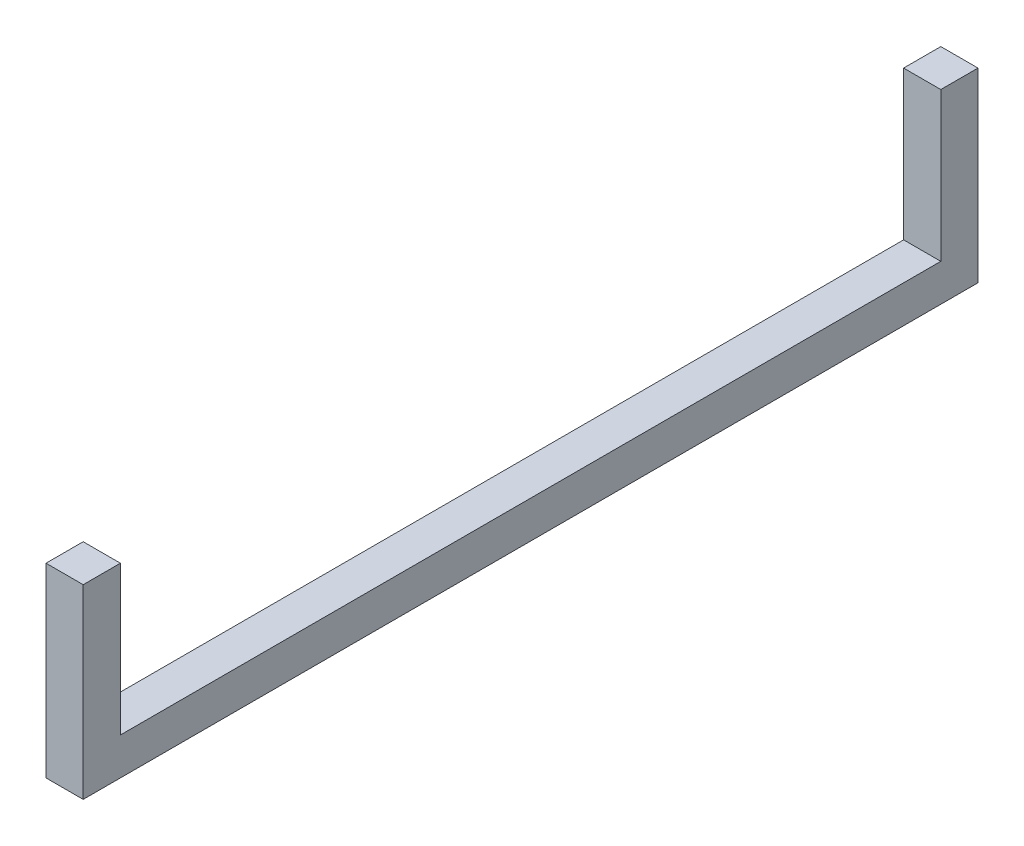
ISO-10303-21;
HEADER;
FILE_DESCRIPTION(('STEP AP214'),'2;1');
FILE_NAME('part.step','',(''),(''),'','','');
FILE_SCHEMA(('AUTOMOTIVE_DESIGN { 1 0 10303 214 1 1 1 1 }'));
ENDSEC;
DATA;
#1=APPLICATION_CONTEXT('core data for automotive mechanical design processes');
#2=APPLICATION_PROTOCOL_DEFINITION('international standard','automotive_design',2000,#1);
#3=PRODUCT_CONTEXT('',#1,'mechanical');
#4=PRODUCT('Part','Part','',(#3));
#5=PRODUCT_RELATED_PRODUCT_CATEGORY('part','',(#4));
#6=PRODUCT_DEFINITION_FORMATION('','',#4);
#7=PRODUCT_DEFINITION_CONTEXT('part definition',#1,'design');
#8=PRODUCT_DEFINITION('design','',#6,#7);
#9=PRODUCT_DEFINITION_SHAPE('','',#8);
#10=(LENGTH_UNIT() NAMED_UNIT(*) SI_UNIT(.MILLI.,.METRE.));
#11=(NAMED_UNIT(*) PLANE_ANGLE_UNIT() SI_UNIT($,.RADIAN.));
#12=(NAMED_UNIT(*) SI_UNIT($,.STERADIAN.) SOLID_ANGLE_UNIT());
#13=UNCERTAINTY_MEASURE_WITH_UNIT(LENGTH_MEASURE(1.E-05),#10,'distance_accuracy_value','');
#14=(GEOMETRIC_REPRESENTATION_CONTEXT(3) GLOBAL_UNCERTAINTY_ASSIGNED_CONTEXT((#13)) GLOBAL_UNIT_ASSIGNED_CONTEXT((#10,
#11,#12)) REPRESENTATION_CONTEXT('',''));
#15=CARTESIAN_POINT('',(0.,0.,0.));
#16=DIRECTION('',(0.,0.,1.));
#17=DIRECTION('',(1.,0.,0.));
#18=AXIS2_PLACEMENT_3D('',#15,#16,#17);
#19=CARTESIAN_POINT('',(-2.5,2.5,120.28));
#20=DIRECTION('',(0.,-1.,0.));
#21=DIRECTION('',(1.,0.,0.));
#22=AXIS2_PLACEMENT_3D('',#19,#20,#21);
#23=PLANE('',#22);
#24=DIRECTION('',(-1.,0.,0.));
#25=VECTOR('',#24,1.);
#26=CARTESIAN_POINT('',(-2.5,2.5,115.28));
#27=LINE('',#26,#25);
#28=CARTESIAN_POINT('',(2.5,2.5,115.28));
#29=VERTEX_POINT('',#28);
#30=CARTESIAN_POINT('',(-2.5,2.5,115.28));
#31=VERTEX_POINT('',#30);
#32=EDGE_CURVE('E143',#29,#31,#27,.T.);
#33=ORIENTED_EDGE('',*,*,#32,.F.);
#34=DIRECTION('',(0.,0.,-1.));
#35=VECTOR('',#34,1.);
#36=CARTESIAN_POINT('',(2.5,2.5,120.28));
#37=LINE('',#36,#35);
#38=CARTESIAN_POINT('',(2.5,2.5,5.));
#39=VERTEX_POINT('',#38);
#40=EDGE_CURVE('E90',#29,#39,#37,.T.);
#41=ORIENTED_EDGE('',*,*,#40,.T.);
#42=DIRECTION('',(1.,0.,0.));
#43=VECTOR('',#42,1.);
#44=CARTESIAN_POINT('',(2.5,2.5,5.));
#45=LINE('',#44,#43);
#46=CARTESIAN_POINT('',(-2.5,2.5,5.00000000000006));
#47=VERTEX_POINT('',#46);
#48=EDGE_CURVE('E115',#47,#39,#45,.T.);
#49=ORIENTED_EDGE('',*,*,#48,.F.);
#50=DIRECTION('',(0.,0.,-1.));
#51=VECTOR('',#50,1.);
#52=CARTESIAN_POINT('',(-2.5,2.5,120.28));
#53=LINE('',#52,#51);
#54=EDGE_CURVE('E37',#31,#47,#53,.T.);
#55=ORIENTED_EDGE('',*,*,#54,.F.);
#56=EDGE_LOOP('',(#33,#41,#49,#55));
#57=FACE_BOUND('',#56,.T.);
#58=ADVANCED_FACE('F33',(#57),#23,.F.);
#59=CARTESIAN_POINT('',(-2.5,2.5,120.28));
#60=DIRECTION('',(1.,0.,0.));
#61=DIRECTION('',(0.,0.,-1.));
#62=AXIS2_PLACEMENT_3D('',#59,#60,#61);
#63=PLANE('',#62);
#64=DIRECTION('',(0.,-1.,0.));
#65=VECTOR('',#64,1.);
#66=CARTESIAN_POINT('',(-2.5,2.5,0.));
#67=LINE('',#66,#65);
#68=CARTESIAN_POINT('',(-2.5,22.5,0.));
#69=VERTEX_POINT('',#68);
#70=CARTESIAN_POINT('',(-2.5,-2.5,0.));
#71=VERTEX_POINT('',#70);
#72=EDGE_CURVE('E80',#69,#71,#67,.T.);
#73=ORIENTED_EDGE('',*,*,#72,.T.);
#74=DIRECTION('',(0.,0.,-1.));
#75=VECTOR('',#74,1.);
#76=CARTESIAN_POINT('',(-2.5,-2.5,120.28));
#77=LINE('',#76,#75);
#78=CARTESIAN_POINT('',(-2.5,-2.5,120.28));
#79=VERTEX_POINT('',#78);
#80=EDGE_CURVE('E11',#79,#71,#77,.T.);
#81=ORIENTED_EDGE('',*,*,#80,.F.);
#82=DIRECTION('',(0.,-1.,0.));
#83=VECTOR('',#82,1.);
#84=CARTESIAN_POINT('',(-2.5,2.5,120.28));
#85=LINE('',#84,#83);
#86=CARTESIAN_POINT('',(-2.5,22.5,120.28));
#87=VERTEX_POINT('',#86);
#88=EDGE_CURVE('E96',#87,#79,#85,.T.);
#89=ORIENTED_EDGE('',*,*,#88,.F.);
#90=DIRECTION('',(0.,0.,1.));
#91=VECTOR('',#90,1.);
#92=CARTESIAN_POINT('',(-2.5,22.5,120.28));
#93=LINE('',#92,#91);
#94=CARTESIAN_POINT('',(-2.5,22.5,115.28));
#95=VERTEX_POINT('',#94);
#96=EDGE_CURVE('E142',#95,#87,#93,.T.);
#97=ORIENTED_EDGE('',*,*,#96,.F.);
#98=DIRECTION('',(0.,-1.,0.));
#99=VECTOR('',#98,1.);
#100=CARTESIAN_POINT('',(-2.5,22.5,115.28));
#101=LINE('',#100,#99);
#102=EDGE_CURVE('E140',#95,#31,#101,.T.);
#103=ORIENTED_EDGE('',*,*,#102,.T.);
#104=ORIENTED_EDGE('',*,*,#54,.T.);
#105=DIRECTION('',(0.,-1.,0.));
#106=VECTOR('',#105,1.);
#107=CARTESIAN_POINT('',(-2.5,22.5,5.));
#108=LINE('',#107,#106);
#109=CARTESIAN_POINT('',(-2.5,22.5,5.));
#110=VERTEX_POINT('',#109);
#111=EDGE_CURVE('E107',#110,#47,#108,.T.);
#112=ORIENTED_EDGE('',*,*,#111,.F.);
#113=DIRECTION('',(0.,0.,1.));
#114=VECTOR('',#113,1.);
#115=CARTESIAN_POINT('',(-2.5,22.5,5.));
#116=LINE('',#115,#114);
#117=EDGE_CURVE('E118',#69,#110,#116,.T.);
#118=ORIENTED_EDGE('',*,*,#117,.F.);
#119=EDGE_LOOP('',(#73,#81,#89,#97,#103,#104,#112,#118));
#120=FACE_BOUND('',#119,.T.);
#121=ADVANCED_FACE('F35',(#120),#63,.F.);
#122=CARTESIAN_POINT('',(-2.5,-2.5,120.28));
#123=DIRECTION('',(0.,1.,0.));
#124=DIRECTION('',(-1.,0.,0.));
#125=AXIS2_PLACEMENT_3D('',#122,#123,#124);
#126=PLANE('',#125);
#127=DIRECTION('',(1.,0.,0.));
#128=VECTOR('',#127,1.);
#129=CARTESIAN_POINT('',(-2.5,-2.5,0.));
#130=LINE('',#129,#128);
#131=CARTESIAN_POINT('',(2.5,-2.5,0.));
#132=VERTEX_POINT('',#131);
#133=EDGE_CURVE('E70',#71,#132,#130,.T.);
#134=ORIENTED_EDGE('',*,*,#133,.T.);
#135=DIRECTION('',(0.,0.,-1.));
#136=VECTOR('',#135,1.);
#137=CARTESIAN_POINT('',(2.5,-2.5,120.28));
#138=LINE('',#137,#136);
#139=CARTESIAN_POINT('',(2.5,-2.5,120.28));
#140=VERTEX_POINT('',#139);
#141=EDGE_CURVE('E43',#140,#132,#138,.T.);
#142=ORIENTED_EDGE('',*,*,#141,.F.);
#143=DIRECTION('',(1.,0.,0.));
#144=VECTOR('',#143,1.);
#145=CARTESIAN_POINT('',(-2.5,-2.5,120.28));
#146=LINE('',#145,#144);
#147=EDGE_CURVE('E59',#79,#140,#146,.T.);
#148=ORIENTED_EDGE('',*,*,#147,.F.);
#149=ORIENTED_EDGE('',*,*,#80,.T.);
#150=EDGE_LOOP('',(#134,#142,#148,#149));
#151=FACE_BOUND('',#150,.T.);
#152=ADVANCED_FACE('F72',(#151),#126,.F.);
#153=CARTESIAN_POINT('',(2.5,2.5,120.28));
#154=DIRECTION('',(-1.,0.,0.));
#155=DIRECTION('',(0.,-1.,0.));
#156=AXIS2_PLACEMENT_3D('',#153,#154,#155);
#157=PLANE('',#156);
#158=DIRECTION('',(0.,1.,0.));
#159=VECTOR('',#158,1.);
#160=CARTESIAN_POINT('',(2.5,2.5,0.));
#161=LINE('',#160,#159);
#162=CARTESIAN_POINT('',(2.5,22.5,0.));
#163=VERTEX_POINT('',#162);
#164=EDGE_CURVE('E79',#132,#163,#161,.T.);
#165=ORIENTED_EDGE('',*,*,#164,.T.);
#166=DIRECTION('',(0.,0.,-1.));
#167=VECTOR('',#166,1.);
#168=CARTESIAN_POINT('',(2.5,22.5,0.));
#169=LINE('',#168,#167);
#170=CARTESIAN_POINT('',(2.5,22.5,5.));
#171=VERTEX_POINT('',#170);
#172=EDGE_CURVE('E133',#171,#163,#169,.T.);
#173=ORIENTED_EDGE('',*,*,#172,.F.);
#174=DIRECTION('',(0.,-1.,0.));
#175=VECTOR('',#174,1.);
#176=CARTESIAN_POINT('',(2.5,22.5,5.));
#177=LINE('',#176,#175);
#178=EDGE_CURVE('E110',#171,#39,#177,.T.);
#179=ORIENTED_EDGE('',*,*,#178,.T.);
#180=ORIENTED_EDGE('',*,*,#40,.F.);
#181=DIRECTION('',(0.,-1.,0.));
#182=VECTOR('',#181,1.);
#183=CARTESIAN_POINT('',(2.5,22.5,115.28));
#184=LINE('',#183,#182);
#185=CARTESIAN_POINT('',(2.5,22.5,115.28));
#186=VERTEX_POINT('',#185);
#187=EDGE_CURVE('E119',#186,#29,#184,.T.);
#188=ORIENTED_EDGE('',*,*,#187,.F.);
#189=DIRECTION('',(0.,0.,-1.));
#190=VECTOR('',#189,1.);
#191=CARTESIAN_POINT('',(2.5,22.5,115.28));
#192=LINE('',#191,#190);
#193=CARTESIAN_POINT('',(2.5,22.5,120.28));
#194=VERTEX_POINT('',#193);
#195=EDGE_CURVE('E152',#194,#186,#192,.T.);
#196=ORIENTED_EDGE('',*,*,#195,.F.);
#197=DIRECTION('',(0.,1.,0.));
#198=VECTOR('',#197,1.);
#199=CARTESIAN_POINT('',(2.5,2.5,120.28));
#200=LINE('',#199,#198);
#201=EDGE_CURVE('E89',#140,#194,#200,.T.);
#202=ORIENTED_EDGE('',*,*,#201,.F.);
#203=ORIENTED_EDGE('',*,*,#141,.T.);
#204=EDGE_LOOP('',(#165,#173,#179,#180,#188,#196,#202,#203));
#205=FACE_BOUND('',#204,.T.);
#206=ADVANCED_FACE('F84',(#205),#157,.F.);
#207=CARTESIAN_POINT('',(0.,0.,120.28));
#208=DIRECTION('',(0.,0.,1.));
#209=DIRECTION('',(1.,0.,0.));
#210=AXIS2_PLACEMENT_3D('',#207,#208,#209);
#211=PLANE('',#210);
#212=ORIENTED_EDGE('',*,*,#88,.T.);
#213=ORIENTED_EDGE('',*,*,#147,.T.);
#214=ORIENTED_EDGE('',*,*,#201,.T.);
#215=DIRECTION('',(1.,0.,0.));
#216=VECTOR('',#215,1.);
#217=CARTESIAN_POINT('',(2.5,22.5,120.28));
#218=LINE('',#217,#216);
#219=EDGE_CURVE('E146',#87,#194,#218,.T.);
#220=ORIENTED_EDGE('',*,*,#219,.F.);
#221=EDGE_LOOP('',(#212,#213,#214,#220));
#222=FACE_BOUND('',#221,.T.);
#223=ADVANCED_FACE('F166',(#222),#211,.T.);
#224=CARTESIAN_POINT('',(0.,0.,0.));
#225=DIRECTION('',(0.,0.,1.));
#226=DIRECTION('',(1.,0.,0.));
#227=AXIS2_PLACEMENT_3D('',#224,#225,#226);
#228=PLANE('',#227);
#229=ORIENTED_EDGE('',*,*,#72,.F.);
#230=DIRECTION('',(-1.,0.,0.));
#231=VECTOR('',#230,1.);
#232=CARTESIAN_POINT('',(-2.5,22.5,0.));
#233=LINE('',#232,#231);
#234=EDGE_CURVE('E95',#163,#69,#233,.T.);
#235=ORIENTED_EDGE('',*,*,#234,.F.);
#236=ORIENTED_EDGE('',*,*,#164,.F.);
#237=ORIENTED_EDGE('',*,*,#133,.F.);
#238=EDGE_LOOP('',(#229,#235,#236,#237));
#239=FACE_BOUND('',#238,.T.);
#240=ADVANCED_FACE('F93',(#239),#228,.F.);
#241=CARTESIAN_POINT('',(2.5,22.5,5.));
#242=DIRECTION('',(0.,0.,-1.));
#243=DIRECTION('',(-1.,0.,0.));
#244=AXIS2_PLACEMENT_3D('',#241,#242,#243);
#245=PLANE('',#244);
#246=ORIENTED_EDGE('',*,*,#48,.T.);
#247=ORIENTED_EDGE('',*,*,#178,.F.);
#248=DIRECTION('',(1.,0.,0.));
#249=VECTOR('',#248,1.);
#250=CARTESIAN_POINT('',(2.5,22.5,5.));
#251=LINE('',#250,#249);
#252=EDGE_CURVE('E134',#110,#171,#251,.T.);
#253=ORIENTED_EDGE('',*,*,#252,.F.);
#254=ORIENTED_EDGE('',*,*,#111,.T.);
#255=EDGE_LOOP('',(#246,#247,#253,#254));
#256=FACE_BOUND('',#255,.T.);
#257=ADVANCED_FACE('F182',(#256),#245,.F.);
#258=CARTESIAN_POINT('',(0.,22.5,0.));
#259=DIRECTION('',(0.,-1.,0.));
#260=DIRECTION('',(1.,0.,0.));
#261=AXIS2_PLACEMENT_3D('',#258,#259,#260);
#262=PLANE('',#261);
#263=ORIENTED_EDGE('',*,*,#117,.T.);
#264=ORIENTED_EDGE('',*,*,#252,.T.);
#265=ORIENTED_EDGE('',*,*,#172,.T.);
#266=ORIENTED_EDGE('',*,*,#234,.T.);
#267=EDGE_LOOP('',(#263,#264,#265,#266));
#268=FACE_BOUND('',#267,.T.);
#269=ADVANCED_FACE('F130',(#268),#262,.F.);
#270=CARTESIAN_POINT('',(-2.5,22.5,115.28));
#271=DIRECTION('',(0.,0.,1.));
#272=DIRECTION('',(1.,0.,0.));
#273=AXIS2_PLACEMENT_3D('',#270,#271,#272);
#274=PLANE('',#273);
#275=ORIENTED_EDGE('',*,*,#32,.T.);
#276=ORIENTED_EDGE('',*,*,#102,.F.);
#277=DIRECTION('',(-1.,0.,0.));
#278=VECTOR('',#277,1.);
#279=CARTESIAN_POINT('',(-2.5,22.5,115.28));
#280=LINE('',#279,#278);
#281=EDGE_CURVE('E149',#186,#95,#280,.T.);
#282=ORIENTED_EDGE('',*,*,#281,.F.);
#283=ORIENTED_EDGE('',*,*,#187,.T.);
#284=EDGE_LOOP('',(#275,#276,#282,#283));
#285=FACE_BOUND('',#284,.T.);
#286=ADVANCED_FACE('F189',(#285),#274,.F.);
#287=CARTESIAN_POINT('',(0.,22.5,0.));
#288=DIRECTION('',(0.,-1.,0.));
#289=DIRECTION('',(1.,0.,0.));
#290=AXIS2_PLACEMENT_3D('',#287,#288,#289);
#291=PLANE('',#290);
#292=ORIENTED_EDGE('',*,*,#219,.T.);
#293=ORIENTED_EDGE('',*,*,#195,.T.);
#294=ORIENTED_EDGE('',*,*,#281,.T.);
#295=ORIENTED_EDGE('',*,*,#96,.T.);
#296=EDGE_LOOP('',(#292,#293,#294,#295));
#297=FACE_BOUND('',#296,.T.);
#298=ADVANCED_FACE('F159',(#297),#291,.F.);
#299=CLOSED_SHELL('',(#58,#121,#152,#206,#223,#240,#257,#269,#286,#298));
#300=MANIFOLD_SOLID_BREP('B2',#299);
#301=ADVANCED_BREP_SHAPE_REPRESENTATION('',(#18,#300),#14);
#302=SHAPE_DEFINITION_REPRESENTATION(#9,#301);
ENDSEC;
END-ISO-10303-21;
